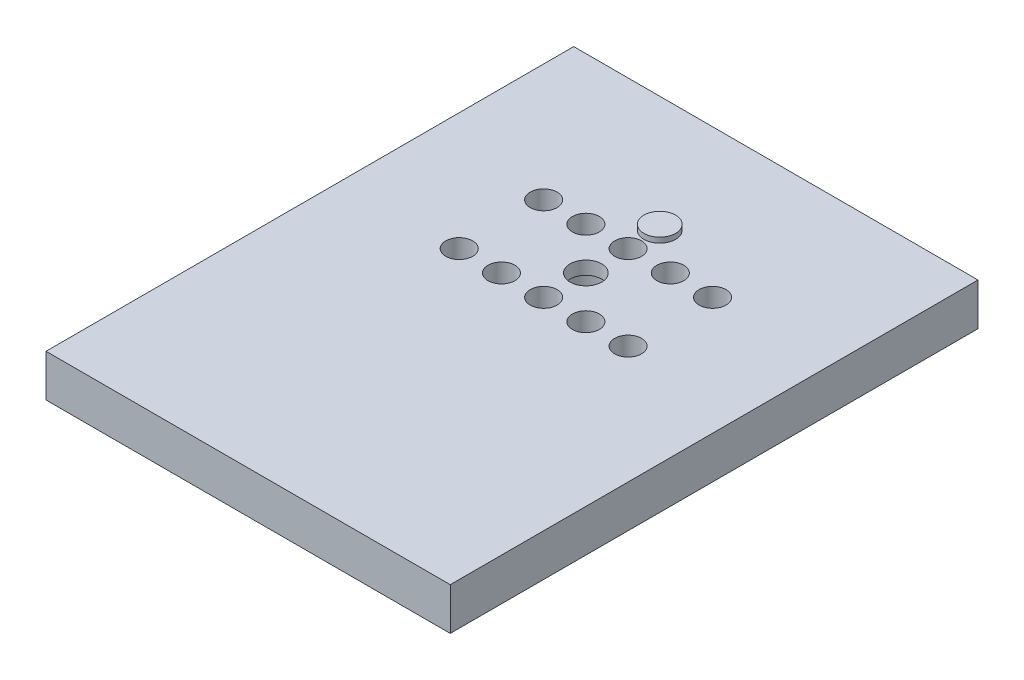
ISO-10303-21;
HEADER;
FILE_DESCRIPTION(('STEP AP214'),'2;1');
FILE_NAME('part.step','',(''),(''),'','','');
FILE_SCHEMA(('AUTOMOTIVE_DESIGN { 1 0 10303 214 1 1 1 1 }'));
ENDSEC;
DATA;
#1=APPLICATION_CONTEXT('core data for automotive mechanical design processes');
#2=APPLICATION_PROTOCOL_DEFINITION('international standard','automotive_design',2000,#1);
#3=PRODUCT_CONTEXT('',#1,'mechanical');
#4=PRODUCT('Part','Part','',(#3));
#5=PRODUCT_RELATED_PRODUCT_CATEGORY('part','',(#4));
#6=PRODUCT_DEFINITION_FORMATION('','',#4);
#7=PRODUCT_DEFINITION_CONTEXT('part definition',#1,'design');
#8=PRODUCT_DEFINITION('design','',#6,#7);
#9=PRODUCT_DEFINITION_SHAPE('','',#8);
#10=(LENGTH_UNIT() NAMED_UNIT(*) SI_UNIT(.MILLI.,.METRE.));
#11=(NAMED_UNIT(*) PLANE_ANGLE_UNIT() SI_UNIT($,.RADIAN.));
#12=(NAMED_UNIT(*) SI_UNIT($,.STERADIAN.) SOLID_ANGLE_UNIT());
#13=UNCERTAINTY_MEASURE_WITH_UNIT(LENGTH_MEASURE(1.E-05),#10,'distance_accuracy_value','');
#14=(GEOMETRIC_REPRESENTATION_CONTEXT(3) GLOBAL_UNCERTAINTY_ASSIGNED_CONTEXT((#13)) GLOBAL_UNIT_ASSIGNED_CONTEXT((#10,
#11,#12)) REPRESENTATION_CONTEXT('',''));
#15=CARTESIAN_POINT('',(0.,0.,0.));
#16=DIRECTION('',(0.,0.,1.));
#17=DIRECTION('',(1.,0.,0.));
#18=AXIS2_PLACEMENT_3D('',#15,#16,#17);
#19=CARTESIAN_POINT('',(0.,0.,-22.));
#20=DIRECTION('',(0.,1.,0.));
#21=DIRECTION('',(0.,0.,1.));
#22=AXIS2_PLACEMENT_3D('',#19,#20,#21);
#23=CYLINDRICAL_SURFACE('',#22,1.05);
#24=CARTESIAN_POINT('',(0.,0.,-22.));
#25=DIRECTION('',(0.,1.,0.));
#26=DIRECTION('',(0.,0.,1.));
#27=AXIS2_PLACEMENT_3D('',#24,#25,#26);
#28=CIRCLE('',#27,1.05);
#29=CARTESIAN_POINT('',(0.,0.,-20.95));
#30=VERTEX_POINT('',#29);
#31=EDGE_CURVE('E170',#30,#30,#28,.T.);
#32=ORIENTED_EDGE('',*,*,#31,.F.);
#33=EDGE_LOOP('',(#32));
#34=FACE_BOUND('',#33,.T.);
#35=CARTESIAN_POINT('',(0.,3.,-22.));
#36=DIRECTION('',(0.,1.,0.));
#37=DIRECTION('',(0.,0.,1.));
#38=AXIS2_PLACEMENT_3D('',#35,#36,#37);
#39=CIRCLE('',#38,1.05);
#40=CARTESIAN_POINT('',(0.,3.,-20.95));
#41=VERTEX_POINT('',#40);
#42=EDGE_CURVE('E37',#41,#41,#39,.F.);
#43=ORIENTED_EDGE('',*,*,#42,.F.);
#44=EDGE_LOOP('',(#43));
#45=FACE_BOUND('',#44,.T.);
#46=ADVANCED_FACE('F33',(#34,#45),#23,.F.);
#47=CARTESIAN_POINT('',(0.,0.,-6.00000000000003));
#48=DIRECTION('',(0.,1.,0.));
#49=DIRECTION('',(0.,0.,1.));
#50=AXIS2_PLACEMENT_3D('',#47,#48,#49);
#51=CYLINDRICAL_SURFACE('',#50,1.05);
#52=CARTESIAN_POINT('',(0.,0.,-6.00000000000003));
#53=DIRECTION('',(0.,1.,0.));
#54=DIRECTION('',(0.,0.,-1.));
#55=AXIS2_PLACEMENT_3D('',#52,#53,#54);
#56=CIRCLE('',#55,1.05);
#57=CARTESIAN_POINT('',(0.,0.,-7.05000000000003));
#58=VERTEX_POINT('',#57);
#59=EDGE_CURVE('E143',#58,#58,#56,.T.);
#60=ORIENTED_EDGE('',*,*,#59,.F.);
#61=EDGE_LOOP('',(#60));
#62=FACE_BOUND('',#61,.T.);
#63=CARTESIAN_POINT('',(0.,3.,-6.00000000000003));
#64=DIRECTION('',(0.,1.,0.));
#65=DIRECTION('',(0.,0.,1.));
#66=AXIS2_PLACEMENT_3D('',#63,#64,#65);
#67=CIRCLE('',#66,1.05);
#68=CARTESIAN_POINT('',(0.,3.,-4.95000000000003));
#69=VERTEX_POINT('',#68);
#70=EDGE_CURVE('E138',#69,#69,#67,.F.);
#71=ORIENTED_EDGE('',*,*,#70,.F.);
#72=EDGE_LOOP('',(#71));
#73=FACE_BOUND('',#72,.T.);
#74=ADVANCED_FACE('F214',(#62,#73),#51,.F.);
#75=CARTESIAN_POINT('',(8.,0.,-22.));
#76=DIRECTION('',(0.,1.,0.));
#77=DIRECTION('',(0.,0.,1.));
#78=AXIS2_PLACEMENT_3D('',#75,#76,#77);
#79=CYLINDRICAL_SURFACE('',#78,1.05);
#80=CARTESIAN_POINT('',(8.,0.,-22.));
#81=DIRECTION('',(0.,1.,0.));
#82=DIRECTION('',(0.,0.,1.));
#83=AXIS2_PLACEMENT_3D('',#80,#81,#82);
#84=CIRCLE('',#83,1.05);
#85=CARTESIAN_POINT('',(8.,0.,-20.95));
#86=VERTEX_POINT('',#85);
#87=EDGE_CURVE('E167',#86,#86,#84,.T.);
#88=ORIENTED_EDGE('',*,*,#87,.F.);
#89=EDGE_LOOP('',(#88));
#90=FACE_BOUND('',#89,.T.);
#91=CARTESIAN_POINT('',(8.,3.,-22.));
#92=DIRECTION('',(0.,1.,0.));
#93=DIRECTION('',(0.,0.,1.));
#94=AXIS2_PLACEMENT_3D('',#91,#92,#93);
#95=CIRCLE('',#94,1.05);
#96=CARTESIAN_POINT('',(8.,3.,-20.95));
#97=VERTEX_POINT('',#96);
#98=EDGE_CURVE('E136',#97,#97,#95,.F.);
#99=ORIENTED_EDGE('',*,*,#98,.F.);
#100=EDGE_LOOP('',(#99));
#101=FACE_BOUND('',#100,.T.);
#102=ADVANCED_FACE('F221',(#90,#101),#79,.F.);
#103=CARTESIAN_POINT('',(16.,0.,-22.));
#104=DIRECTION('',(0.,1.,0.));
#105=DIRECTION('',(0.,0.,1.));
#106=AXIS2_PLACEMENT_3D('',#103,#104,#105);
#107=CYLINDRICAL_SURFACE('',#106,1.05);
#108=CARTESIAN_POINT('',(16.,0.,-22.));
#109=DIRECTION('',(0.,1.,0.));
#110=DIRECTION('',(0.,0.,1.));
#111=AXIS2_PLACEMENT_3D('',#108,#109,#110);
#112=CIRCLE('',#111,1.05);
#113=CARTESIAN_POINT('',(16.,0.,-20.95));
#114=VERTEX_POINT('',#113);
#115=EDGE_CURVE('E171',#114,#114,#112,.T.);
#116=ORIENTED_EDGE('',*,*,#115,.F.);
#117=EDGE_LOOP('',(#116));
#118=FACE_BOUND('',#117,.T.);
#119=CARTESIAN_POINT('',(16.,3.,-22.));
#120=DIRECTION('',(0.,1.,0.));
#121=DIRECTION('',(0.,0.,1.));
#122=AXIS2_PLACEMENT_3D('',#119,#120,#121);
#123=CIRCLE('',#122,1.05);
#124=CARTESIAN_POINT('',(16.,3.,-20.95));
#125=VERTEX_POINT('',#124);
#126=EDGE_CURVE('E133',#125,#125,#123,.F.);
#127=ORIENTED_EDGE('',*,*,#126,.F.);
#128=EDGE_LOOP('',(#127));
#129=FACE_BOUND('',#128,.T.);
#130=ADVANCED_FACE('F324',(#118,#129),#107,.F.);
#131=CARTESIAN_POINT('',(-16.,0.,-6.00000000000013));
#132=DIRECTION('',(0.,1.,0.));
#133=DIRECTION('',(0.,0.,1.));
#134=AXIS2_PLACEMENT_3D('',#131,#132,#133);
#135=CYLINDRICAL_SURFACE('',#134,1.05);
#136=CARTESIAN_POINT('',(-16.,0.,-6.00000000000013));
#137=DIRECTION('',(0.,1.,0.));
#138=DIRECTION('',(0.,0.,-1.));
#139=AXIS2_PLACEMENT_3D('',#136,#137,#138);
#140=CIRCLE('',#139,1.05);
#141=CARTESIAN_POINT('',(-16.,0.,-7.05000000000013));
#142=VERTEX_POINT('',#141);
#143=EDGE_CURVE('E174',#142,#142,#140,.T.);
#144=ORIENTED_EDGE('',*,*,#143,.F.);
#145=EDGE_LOOP('',(#144));
#146=FACE_BOUND('',#145,.T.);
#147=CARTESIAN_POINT('',(-16.,3.,-6.00000000000013));
#148=DIRECTION('',(0.,1.,0.));
#149=DIRECTION('',(0.,0.,1.));
#150=AXIS2_PLACEMENT_3D('',#147,#148,#149);
#151=CIRCLE('',#150,1.05);
#152=CARTESIAN_POINT('',(-16.,3.,-4.95000000000013));
#153=VERTEX_POINT('',#152);
#154=EDGE_CURVE('E130',#153,#153,#151,.F.);
#155=ORIENTED_EDGE('',*,*,#154,.F.);
#156=EDGE_LOOP('',(#155));
#157=FACE_BOUND('',#156,.T.);
#158=ADVANCED_FACE('F334',(#146,#157),#135,.F.);
#159=CARTESIAN_POINT('',(-8.,0.,-22.));
#160=DIRECTION('',(0.,1.,0.));
#161=DIRECTION('',(0.,0.,1.));
#162=AXIS2_PLACEMENT_3D('',#159,#160,#161);
#163=CYLINDRICAL_SURFACE('',#162,1.05);
#164=CARTESIAN_POINT('',(-8.,0.,-22.));
#165=DIRECTION('',(0.,1.,0.));
#166=DIRECTION('',(0.,0.,1.));
#167=AXIS2_PLACEMENT_3D('',#164,#165,#166);
#168=CIRCLE('',#167,1.05);
#169=CARTESIAN_POINT('',(-8.,0.,-20.95));
#170=VERTEX_POINT('',#169);
#171=EDGE_CURVE('E161',#170,#170,#168,.T.);
#172=ORIENTED_EDGE('',*,*,#171,.F.);
#173=EDGE_LOOP('',(#172));
#174=FACE_BOUND('',#173,.T.);
#175=CARTESIAN_POINT('',(-8.,3.,-22.));
#176=DIRECTION('',(0.,1.,0.));
#177=DIRECTION('',(0.,0.,1.));
#178=AXIS2_PLACEMENT_3D('',#175,#176,#177);
#179=CIRCLE('',#178,1.05);
#180=CARTESIAN_POINT('',(-8.,3.,-20.95));
#181=VERTEX_POINT('',#180);
#182=EDGE_CURVE('E127',#181,#181,#179,.F.);
#183=ORIENTED_EDGE('',*,*,#182,.F.);
#184=EDGE_LOOP('',(#183));
#185=FACE_BOUND('',#184,.T.);
#186=ADVANCED_FACE('F228',(#174,#185),#163,.F.);
#187=CARTESIAN_POINT('',(-16.,0.,-21.9999999999999));
#188=DIRECTION('',(0.,1.,0.));
#189=DIRECTION('',(0.,0.,1.));
#190=AXIS2_PLACEMENT_3D('',#187,#188,#189);
#191=CYLINDRICAL_SURFACE('',#190,1.05);
#192=CARTESIAN_POINT('',(-16.,0.,-21.9999999999999));
#193=DIRECTION('',(0.,1.,0.));
#194=DIRECTION('',(0.,0.,1.));
#195=AXIS2_PLACEMENT_3D('',#192,#193,#194);
#196=CIRCLE('',#195,1.05);
#197=CARTESIAN_POINT('',(-16.,0.,-20.9499999999999));
#198=VERTEX_POINT('',#197);
#199=EDGE_CURVE('E158',#198,#198,#196,.T.);
#200=ORIENTED_EDGE('',*,*,#199,.F.);
#201=EDGE_LOOP('',(#200));
#202=FACE_BOUND('',#201,.T.);
#203=CARTESIAN_POINT('',(-16.,3.,-21.9999999999999));
#204=DIRECTION('',(0.,1.,0.));
#205=DIRECTION('',(0.,0.,1.));
#206=AXIS2_PLACEMENT_3D('',#203,#204,#205);
#207=CIRCLE('',#206,1.05);
#208=CARTESIAN_POINT('',(-16.,3.,-20.9499999999999));
#209=VERTEX_POINT('',#208);
#210=EDGE_CURVE('E124',#209,#209,#207,.F.);
#211=ORIENTED_EDGE('',*,*,#210,.F.);
#212=EDGE_LOOP('',(#211));
#213=FACE_BOUND('',#212,.T.);
#214=ADVANCED_FACE('F352',(#202,#213),#191,.F.);
#215=CARTESIAN_POINT('',(-8.,0.,-6.00000000000008));
#216=DIRECTION('',(0.,1.,0.));
#217=DIRECTION('',(0.,0.,1.));
#218=AXIS2_PLACEMENT_3D('',#215,#216,#217);
#219=CYLINDRICAL_SURFACE('',#218,1.05);
#220=CARTESIAN_POINT('',(-8.,0.,-6.00000000000008));
#221=DIRECTION('',(0.,1.,0.));
#222=DIRECTION('',(0.,0.,-1.));
#223=AXIS2_PLACEMENT_3D('',#220,#221,#222);
#224=CIRCLE('',#223,1.05);
#225=CARTESIAN_POINT('',(-8.,0.,-7.05000000000008));
#226=VERTEX_POINT('',#225);
#227=EDGE_CURVE('E162',#226,#226,#224,.T.);
#228=ORIENTED_EDGE('',*,*,#227,.F.);
#229=EDGE_LOOP('',(#228));
#230=FACE_BOUND('',#229,.T.);
#231=CARTESIAN_POINT('',(-8.,3.,-6.00000000000008));
#232=DIRECTION('',(0.,1.,0.));
#233=DIRECTION('',(0.,0.,1.));
#234=AXIS2_PLACEMENT_3D('',#231,#232,#233);
#235=CIRCLE('',#234,1.05);
#236=CARTESIAN_POINT('',(-8.,3.,-4.95000000000008));
#237=VERTEX_POINT('',#236);
#238=EDGE_CURVE('E121',#237,#237,#235,.F.);
#239=ORIENTED_EDGE('',*,*,#238,.F.);
#240=EDGE_LOOP('',(#239));
#241=FACE_BOUND('',#240,.T.);
#242=ADVANCED_FACE('F361',(#230,#241),#219,.F.);
#243=CARTESIAN_POINT('',(16.,0.,-6.00000000000003));
#244=DIRECTION('',(0.,1.,0.));
#245=DIRECTION('',(0.,0.,1.));
#246=AXIS2_PLACEMENT_3D('',#243,#244,#245);
#247=CYLINDRICAL_SURFACE('',#246,1.05);
#248=CARTESIAN_POINT('',(16.,0.,-6.00000000000003));
#249=DIRECTION('',(0.,1.,0.));
#250=DIRECTION('',(0.,0.,-1.));
#251=AXIS2_PLACEMENT_3D('',#248,#249,#250);
#252=CIRCLE('',#251,1.05);
#253=CARTESIAN_POINT('',(16.,0.,-7.05000000000003));
#254=VERTEX_POINT('',#253);
#255=EDGE_CURVE('E152',#254,#254,#252,.T.);
#256=ORIENTED_EDGE('',*,*,#255,.F.);
#257=EDGE_LOOP('',(#256));
#258=FACE_BOUND('',#257,.T.);
#259=CARTESIAN_POINT('',(16.,3.,-6.00000000000003));
#260=DIRECTION('',(0.,1.,0.));
#261=DIRECTION('',(0.,0.,1.));
#262=AXIS2_PLACEMENT_3D('',#259,#260,#261);
#263=CIRCLE('',#262,1.05);
#264=CARTESIAN_POINT('',(16.,3.,-4.95000000000003));
#265=VERTEX_POINT('',#264);
#266=EDGE_CURVE('E117',#265,#265,#263,.F.);
#267=ORIENTED_EDGE('',*,*,#266,.F.);
#268=EDGE_LOOP('',(#267));
#269=FACE_BOUND('',#268,.T.);
#270=ADVANCED_FACE('F371',(#258,#269),#247,.F.);
#271=CARTESIAN_POINT('',(8.,0.,-6.00000000000003));
#272=DIRECTION('',(0.,1.,0.));
#273=DIRECTION('',(0.,0.,1.));
#274=AXIS2_PLACEMENT_3D('',#271,#272,#273);
#275=CYLINDRICAL_SURFACE('',#274,1.05);
#276=CARTESIAN_POINT('',(8.,0.,-6.00000000000003));
#277=DIRECTION('',(0.,1.,0.));
#278=DIRECTION('',(0.,0.,-1.));
#279=AXIS2_PLACEMENT_3D('',#276,#277,#278);
#280=CIRCLE('',#279,1.05);
#281=CARTESIAN_POINT('',(8.,0.,-7.05000000000003));
#282=VERTEX_POINT('',#281);
#283=EDGE_CURVE('E147',#282,#282,#280,.T.);
#284=ORIENTED_EDGE('',*,*,#283,.F.);
#285=EDGE_LOOP('',(#284));
#286=FACE_BOUND('',#285,.T.);
#287=CARTESIAN_POINT('',(8.,3.,-6.00000000000003));
#288=DIRECTION('',(0.,1.,0.));
#289=DIRECTION('',(0.,0.,1.));
#290=AXIS2_PLACEMENT_3D('',#287,#288,#289);
#291=CIRCLE('',#290,1.05);
#292=CARTESIAN_POINT('',(8.,3.,-4.95000000000003));
#293=VERTEX_POINT('',#292);
#294=EDGE_CURVE('E114',#293,#293,#291,.F.);
#295=ORIENTED_EDGE('',*,*,#294,.F.);
#296=EDGE_LOOP('',(#295));
#297=FACE_BOUND('',#296,.T.);
#298=ADVANCED_FACE('F209',(#286,#297),#275,.F.);
#299=CARTESIAN_POINT('',(0.,8.,-14.));
#300=DIRECTION('',(0.,-1.,0.));
#301=DIRECTION('',(0.,0.,-1.));
#302=AXIS2_PLACEMENT_3D('',#299,#300,#301);
#303=CYLINDRICAL_SURFACE('',#302,3.);
#304=CARTESIAN_POINT('',(0.,8.,-14.));
#305=DIRECTION('',(0.,1.,0.));
#306=DIRECTION('',(0.,0.,1.));
#307=AXIS2_PLACEMENT_3D('',#304,#305,#306);
#308=CIRCLE('',#307,3.);
#309=CARTESIAN_POINT('',(0.,8.,-11.));
#310=VERTEX_POINT('',#309);
#311=EDGE_CURVE('E104',#310,#310,#308,.T.);
#312=ORIENTED_EDGE('',*,*,#311,.T.);
#313=EDGE_LOOP('',(#312));
#314=FACE_BOUND('',#313,.T.);
#315=CARTESIAN_POINT('',(0.,5.5,-14.));
#316=DIRECTION('',(0.,-1.,0.));
#317=DIRECTION('',(0.,0.,-1.));
#318=AXIS2_PLACEMENT_3D('',#315,#316,#317);
#319=CIRCLE('',#318,3.);
#320=CARTESIAN_POINT('',(0.,5.5,-17.));
#321=VERTEX_POINT('',#320);
#322=EDGE_CURVE('E110',#321,#321,#319,.T.);
#323=ORIENTED_EDGE('',*,*,#322,.T.);
#324=EDGE_LOOP('',(#323));
#325=FACE_BOUND('',#324,.T.);
#326=ADVANCED_FACE('F195',(#314,#325),#303,.F.);
#327=CARTESIAN_POINT('',(0.,8.,0.));
#328=DIRECTION('',(0.,1.,0.));
#329=DIRECTION('',(0.,0.,1.));
#330=AXIS2_PLACEMENT_3D('',#327,#328,#329);
#331=PLANE('',#330);
#332=CARTESIAN_POINT('',(1.66533453693773E-13,8.,-5.9999999999999));
#333=DIRECTION('',(0.,1.,0.));
#334=DIRECTION('',(0.,0.,1.));
#335=AXIS2_PLACEMENT_3D('',#332,#333,#334);
#336=CIRCLE('',#335,2.55);
#337=CARTESIAN_POINT('',(1.66533453693773E-13,8.,-3.4499999999999));
#338=VERTEX_POINT('',#337);
#339=EDGE_CURVE('E639',#338,#338,#336,.T.);
#340=ORIENTED_EDGE('',*,*,#339,.F.);
#341=EDGE_LOOP('',(#340));
#342=FACE_BOUND('',#341,.T.);
#343=CARTESIAN_POINT('',(8.00000000000017,8.,-5.9999999999999));
#344=DIRECTION('',(0.,1.,0.));
#345=DIRECTION('',(0.,0.,1.));
#346=AXIS2_PLACEMENT_3D('',#343,#344,#345);
#347=CIRCLE('',#346,2.55);
#348=CARTESIAN_POINT('',(8.00000000000017,8.,-3.4499999999999));
#349=VERTEX_POINT('',#348);
#350=EDGE_CURVE('E629',#349,#349,#347,.T.);
#351=ORIENTED_EDGE('',*,*,#350,.F.);
#352=EDGE_LOOP('',(#351));
#353=FACE_BOUND('',#352,.T.);
#354=CARTESIAN_POINT('',(16.0000000000002,8.,-5.9999999999999));
#355=DIRECTION('',(0.,1.,0.));
#356=DIRECTION('',(0.,0.,1.));
#357=AXIS2_PLACEMENT_3D('',#354,#355,#356);
#358=CIRCLE('',#357,2.55);
#359=CARTESIAN_POINT('',(16.0000000000002,8.,-3.4499999999999));
#360=VERTEX_POINT('',#359);
#361=EDGE_CURVE('E655',#360,#360,#358,.T.);
#362=ORIENTED_EDGE('',*,*,#361,.F.);
#363=EDGE_LOOP('',(#362));
#364=FACE_BOUND('',#363,.T.);
#365=CARTESIAN_POINT('',(-15.9999999999998,8.,-5.9999999999999));
#366=DIRECTION('',(0.,1.,0.));
#367=DIRECTION('',(0.,0.,1.));
#368=AXIS2_PLACEMENT_3D('',#365,#366,#367);
#369=CIRCLE('',#368,2.55);
#370=CARTESIAN_POINT('',(-15.9999999999998,8.,-3.4499999999999));
#371=VERTEX_POINT('',#370);
#372=EDGE_CURVE('E646',#371,#371,#369,.T.);
#373=ORIENTED_EDGE('',*,*,#372,.F.);
#374=EDGE_LOOP('',(#373));
#375=FACE_BOUND('',#374,.T.);
#376=CARTESIAN_POINT('',(0.,8.,-21.9999999999999));
#377=DIRECTION('',(0.,1.,0.));
#378=DIRECTION('',(0.,0.,1.));
#379=AXIS2_PLACEMENT_3D('',#376,#377,#378);
#380=CIRCLE('',#379,2.55);
#381=CARTESIAN_POINT('',(0.,8.,-19.4499999999999));
#382=VERTEX_POINT('',#381);
#383=EDGE_CURVE('E595',#382,#382,#380,.T.);
#384=ORIENTED_EDGE('',*,*,#383,.F.);
#385=EDGE_LOOP('',(#384));
#386=FACE_BOUND('',#385,.T.);
#387=CARTESIAN_POINT('',(8.,8.,-21.9999999999999));
#388=DIRECTION('',(0.,1.,0.));
#389=DIRECTION('',(0.,0.,1.));
#390=AXIS2_PLACEMENT_3D('',#387,#388,#389);
#391=CIRCLE('',#390,2.55);
#392=CARTESIAN_POINT('',(8.,8.,-19.4499999999999));
#393=VERTEX_POINT('',#392);
#394=EDGE_CURVE('E601',#393,#393,#391,.T.);
#395=ORIENTED_EDGE('',*,*,#394,.F.);
#396=EDGE_LOOP('',(#395));
#397=FACE_BOUND('',#396,.T.);
#398=CARTESIAN_POINT('',(16.,8.,-21.9999999999999));
#399=DIRECTION('',(0.,1.,0.));
#400=DIRECTION('',(0.,0.,1.));
#401=AXIS2_PLACEMENT_3D('',#398,#399,#400);
#402=CIRCLE('',#401,2.55);
#403=CARTESIAN_POINT('',(16.,8.,-19.4499999999999));
#404=VERTEX_POINT('',#403);
#405=EDGE_CURVE('E622',#404,#404,#402,.T.);
#406=ORIENTED_EDGE('',*,*,#405,.F.);
#407=EDGE_LOOP('',(#406));
#408=FACE_BOUND('',#407,.T.);
#409=CARTESIAN_POINT('',(-7.99999999999983,8.,-5.9999999999999));
#410=DIRECTION('',(0.,1.,0.));
#411=DIRECTION('',(0.,0.,1.));
#412=AXIS2_PLACEMENT_3D('',#409,#410,#411);
#413=CIRCLE('',#412,2.55);
#414=CARTESIAN_POINT('',(-7.99999999999983,8.,-3.4499999999999));
#415=VERTEX_POINT('',#414);
#416=EDGE_CURVE('E633',#415,#415,#413,.T.);
#417=ORIENTED_EDGE('',*,*,#416,.F.);
#418=EDGE_LOOP('',(#417));
#419=FACE_BOUND('',#418,.T.);
#420=CARTESIAN_POINT('',(-16.,8.,-21.9999999999999));
#421=DIRECTION('',(0.,1.,0.));
#422=DIRECTION('',(0.,0.,1.));
#423=AXIS2_PLACEMENT_3D('',#420,#421,#422);
#424=CIRCLE('',#423,2.55);
#425=CARTESIAN_POINT('',(-16.,8.,-19.4499999999999));
#426=VERTEX_POINT('',#425);
#427=EDGE_CURVE('E662',#426,#426,#424,.T.);
#428=ORIENTED_EDGE('',*,*,#427,.F.);
#429=EDGE_LOOP('',(#428));
#430=FACE_BOUND('',#429,.T.);
#431=CARTESIAN_POINT('',(-8.,8.,-21.9999999999999));
#432=DIRECTION('',(0.,1.,0.));
#433=DIRECTION('',(0.,0.,1.));
#434=AXIS2_PLACEMENT_3D('',#431,#432,#433);
#435=CIRCLE('',#434,2.55);
#436=CARTESIAN_POINT('',(-8.,8.,-19.4499999999999));
#437=VERTEX_POINT('',#436);
#438=EDGE_CURVE('E156',#437,#437,#435,.T.);
#439=ORIENTED_EDGE('',*,*,#438,.F.);
#440=EDGE_LOOP('',(#439));
#441=FACE_BOUND('',#440,.T.);
#442=CARTESIAN_POINT('',(0.,8.,-28.));
#443=DIRECTION('',(0.,1.,0.));
#444=DIRECTION('',(0.,0.,1.));
#445=AXIS2_PLACEMENT_3D('',#442,#443,#444);
#446=CIRCLE('',#445,3.);
#447=CARTESIAN_POINT('',(0.,8.,-25.));
#448=VERTEX_POINT('',#447);
#449=EDGE_CURVE('E181',#448,#448,#446,.T.);
#450=ORIENTED_EDGE('',*,*,#449,.F.);
#451=EDGE_LOOP('',(#450));
#452=FACE_BOUND('',#451,.T.);
#453=DIRECTION('',(0.,0.,-1.));
#454=VECTOR('',#453,1.);
#455=CARTESIAN_POINT('',(38.3,8.,-50.));
#456=LINE('',#455,#454);
#457=CARTESIAN_POINT('',(38.3,8.,50.));
#458=VERTEX_POINT('',#457);
#459=CARTESIAN_POINT('',(38.3,8.,-50.));
#460=VERTEX_POINT('',#459);
#461=EDGE_CURVE('E88',#458,#460,#456,.T.);
#462=ORIENTED_EDGE('',*,*,#461,.T.);
#463=DIRECTION('',(-1.,0.,0.));
#464=VECTOR('',#463,1.);
#465=CARTESIAN_POINT('',(-38.3,8.,-50.));
#466=LINE('',#465,#464);
#467=CARTESIAN_POINT('',(-38.3,8.,-50.));
#468=VERTEX_POINT('',#467);
#469=EDGE_CURVE('E82',#460,#468,#466,.T.);
#470=ORIENTED_EDGE('',*,*,#469,.T.);
#471=DIRECTION('',(0.,0.,1.));
#472=VECTOR('',#471,1.);
#473=CARTESIAN_POINT('',(-38.3,8.,-50.));
#474=LINE('',#473,#472);
#475=CARTESIAN_POINT('',(-38.3,8.,50.));
#476=VERTEX_POINT('',#475);
#477=EDGE_CURVE('E86',#468,#476,#474,.T.);
#478=ORIENTED_EDGE('',*,*,#477,.T.);
#479=DIRECTION('',(1.,0.,0.));
#480=VECTOR('',#479,1.);
#481=CARTESIAN_POINT('',(-38.3,8.,50.));
#482=LINE('',#481,#480);
#483=EDGE_CURVE('E52',#476,#458,#482,.T.);
#484=ORIENTED_EDGE('',*,*,#483,.T.);
#485=EDGE_LOOP('',(#462,#470,#478,#484));
#486=FACE_BOUND('',#485,.T.);
#487=ORIENTED_EDGE('',*,*,#311,.F.);
#488=EDGE_LOOP('',(#487));
#489=FACE_BOUND('',#488,.T.);
#490=ADVANCED_FACE('F83',(#342,#353,#364,#375,#386,#397,#408,#419,#430,#441,#452,#486,#489),
#331,.T.);
#491=CARTESIAN_POINT('',(0.,0.,0.));
#492=DIRECTION('',(0.,1.,0.));
#493=DIRECTION('',(0.,0.,1.));
#494=AXIS2_PLACEMENT_3D('',#491,#492,#493);
#495=PLANE('',#494);
#496=ORIENTED_EDGE('',*,*,#283,.T.);
#497=EDGE_LOOP('',(#496));
#498=FACE_BOUND('',#497,.T.);
#499=ORIENTED_EDGE('',*,*,#255,.T.);
#500=EDGE_LOOP('',(#499));
#501=FACE_BOUND('',#500,.T.);
#502=ORIENTED_EDGE('',*,*,#227,.T.);
#503=EDGE_LOOP('',(#502));
#504=FACE_BOUND('',#503,.T.);
#505=ORIENTED_EDGE('',*,*,#199,.T.);
#506=EDGE_LOOP('',(#505));
#507=FACE_BOUND('',#506,.T.);
#508=ORIENTED_EDGE('',*,*,#171,.T.);
#509=EDGE_LOOP('',(#508));
#510=FACE_BOUND('',#509,.T.);
#511=ORIENTED_EDGE('',*,*,#143,.T.);
#512=EDGE_LOOP('',(#511));
#513=FACE_BOUND('',#512,.T.);
#514=ORIENTED_EDGE('',*,*,#115,.T.);
#515=EDGE_LOOP('',(#514));
#516=FACE_BOUND('',#515,.T.);
#517=ORIENTED_EDGE('',*,*,#87,.T.);
#518=EDGE_LOOP('',(#517));
#519=FACE_BOUND('',#518,.T.);
#520=ORIENTED_EDGE('',*,*,#59,.T.);
#521=EDGE_LOOP('',(#520));
#522=FACE_BOUND('',#521,.T.);
#523=ORIENTED_EDGE('',*,*,#31,.T.);
#524=EDGE_LOOP('',(#523));
#525=FACE_BOUND('',#524,.T.);
#526=CARTESIAN_POINT('',(0.,0.,-14.));
#527=DIRECTION('',(0.,-1.,0.));
#528=DIRECTION('',(0.,0.,-1.));
#529=AXIS2_PLACEMENT_3D('',#526,#527,#528);
#530=CIRCLE('',#529,4.5);
#531=CARTESIAN_POINT('',(0.,0.,-18.5));
#532=VERTEX_POINT('',#531);
#533=EDGE_CURVE('E185',#532,#532,#530,.T.);
#534=ORIENTED_EDGE('',*,*,#533,.F.);
#535=EDGE_LOOP('',(#534));
#536=FACE_BOUND('',#535,.T.);
#537=DIRECTION('',(0.,0.,-1.));
#538=VECTOR('',#537,1.);
#539=CARTESIAN_POINT('',(38.3,0.,-50.));
#540=LINE('',#539,#538);
#541=CARTESIAN_POINT('',(38.3,0.,50.));
#542=VERTEX_POINT('',#541);
#543=CARTESIAN_POINT('',(38.3,0.,-50.));
#544=VERTEX_POINT('',#543);
#545=EDGE_CURVE('E101',#542,#544,#540,.T.);
#546=ORIENTED_EDGE('',*,*,#545,.F.);
#547=DIRECTION('',(1.,0.,0.));
#548=VECTOR('',#547,1.);
#549=CARTESIAN_POINT('',(-38.3,0.,50.));
#550=LINE('',#549,#548);
#551=CARTESIAN_POINT('',(-38.3,0.,50.));
#552=VERTEX_POINT('',#551);
#553=EDGE_CURVE('E75',#552,#542,#550,.T.);
#554=ORIENTED_EDGE('',*,*,#553,.F.);
#555=DIRECTION('',(0.,0.,1.));
#556=VECTOR('',#555,1.);
#557=CARTESIAN_POINT('',(-38.3,0.,-50.));
#558=LINE('',#557,#556);
#559=CARTESIAN_POINT('',(-38.3,0.,-50.));
#560=VERTEX_POINT('',#559);
#561=EDGE_CURVE('E69',#560,#552,#558,.T.);
#562=ORIENTED_EDGE('',*,*,#561,.F.);
#563=DIRECTION('',(-1.,0.,0.));
#564=VECTOR('',#563,1.);
#565=CARTESIAN_POINT('',(-38.3,0.,-50.));
#566=LINE('',#565,#564);
#567=EDGE_CURVE('E92',#544,#560,#566,.T.);
#568=ORIENTED_EDGE('',*,*,#567,.F.);
#569=EDGE_LOOP('',(#546,#554,#562,#568));
#570=FACE_BOUND('',#569,.T.);
#571=ADVANCED_FACE('F198',(#498,#501,#504,#507,#510,#513,#516,#519,#522,#525,#536,#570),#495,.F.);
#572=CARTESIAN_POINT('',(38.3,8.,-50.));
#573=DIRECTION('',(-1.,0.,0.));
#574=DIRECTION('',(0.,0.,1.));
#575=AXIS2_PLACEMENT_3D('',#572,#573,#574);
#576=PLANE('',#575);
#577=ORIENTED_EDGE('',*,*,#545,.T.);
#578=DIRECTION('',(0.,-1.,0.));
#579=VECTOR('',#578,1.);
#580=CARTESIAN_POINT('',(38.3,8.,-50.));
#581=LINE('',#580,#579);
#582=EDGE_CURVE('E11',#460,#544,#581,.T.);
#583=ORIENTED_EDGE('',*,*,#582,.F.);
#584=ORIENTED_EDGE('',*,*,#461,.F.);
#585=DIRECTION('',(0.,-1.,0.));
#586=VECTOR('',#585,1.);
#587=CARTESIAN_POINT('',(38.3,8.,50.));
#588=LINE('',#587,#586);
#589=EDGE_CURVE('E97',#458,#542,#588,.T.);
#590=ORIENTED_EDGE('',*,*,#589,.T.);
#591=EDGE_LOOP('',(#577,#583,#584,#590));
#592=FACE_BOUND('',#591,.T.);
#593=ADVANCED_FACE('F35',(#592),#576,.F.);
#594=CARTESIAN_POINT('',(-38.3,8.,-50.));
#595=DIRECTION('',(0.,0.,1.));
#596=DIRECTION('',(1.,0.,0.));
#597=AXIS2_PLACEMENT_3D('',#594,#595,#596);
#598=PLANE('',#597);
#599=ORIENTED_EDGE('',*,*,#567,.T.);
#600=DIRECTION('',(0.,-1.,0.));
#601=VECTOR('',#600,1.);
#602=CARTESIAN_POINT('',(-38.3,8.,-50.));
#603=LINE('',#602,#601);
#604=EDGE_CURVE('E43',#468,#560,#603,.T.);
#605=ORIENTED_EDGE('',*,*,#604,.F.);
#606=ORIENTED_EDGE('',*,*,#469,.F.);
#607=ORIENTED_EDGE('',*,*,#582,.T.);
#608=EDGE_LOOP('',(#599,#605,#606,#607));
#609=FACE_BOUND('',#608,.T.);
#610=ADVANCED_FACE('F91',(#609),#598,.F.);
#611=CARTESIAN_POINT('',(-38.3,8.,-50.));
#612=DIRECTION('',(1.,0.,0.));
#613=DIRECTION('',(0.,0.,-1.));
#614=AXIS2_PLACEMENT_3D('',#611,#612,#613);
#615=PLANE('',#614);
#616=ORIENTED_EDGE('',*,*,#561,.T.);
#617=DIRECTION('',(0.,-1.,0.));
#618=VECTOR('',#617,1.);
#619=CARTESIAN_POINT('',(-38.3,8.,50.));
#620=LINE('',#619,#618);
#621=EDGE_CURVE('E93',#476,#552,#620,.T.);
#622=ORIENTED_EDGE('',*,*,#621,.F.);
#623=ORIENTED_EDGE('',*,*,#477,.F.);
#624=ORIENTED_EDGE('',*,*,#604,.T.);
#625=EDGE_LOOP('',(#616,#622,#623,#624));
#626=FACE_BOUND('',#625,.T.);
#627=ADVANCED_FACE('F95',(#626),#615,.F.);
#628=CARTESIAN_POINT('',(-38.3,8.,50.));
#629=DIRECTION('',(0.,0.,-1.));
#630=DIRECTION('',(-1.,0.,0.));
#631=AXIS2_PLACEMENT_3D('',#628,#629,#630);
#632=PLANE('',#631);
#633=ORIENTED_EDGE('',*,*,#553,.T.);
#634=ORIENTED_EDGE('',*,*,#589,.F.);
#635=ORIENTED_EDGE('',*,*,#483,.F.);
#636=ORIENTED_EDGE('',*,*,#621,.T.);
#637=EDGE_LOOP('',(#633,#634,#635,#636));
#638=FACE_BOUND('',#637,.T.);
#639=ADVANCED_FACE('F244',(#638),#632,.F.);
#640=CARTESIAN_POINT('',(0.,5.5,-14.));
#641=DIRECTION('',(0.,-1.,0.));
#642=DIRECTION('',(0.,0.,-1.));
#643=AXIS2_PLACEMENT_3D('',#640,#641,#642);
#644=CYLINDRICAL_SURFACE('',#643,4.5);
#645=CARTESIAN_POINT('',(0.,5.5,-14.));
#646=DIRECTION('',(0.,-1.,0.));
#647=DIRECTION('',(0.,0.,-1.));
#648=AXIS2_PLACEMENT_3D('',#645,#646,#647);
#649=CIRCLE('',#648,4.5);
#650=CARTESIAN_POINT('',(0.,5.5,-18.5));
#651=VERTEX_POINT('',#650);
#652=EDGE_CURVE('E113',#651,#651,#649,.T.);
#653=ORIENTED_EDGE('',*,*,#652,.F.);
#654=EDGE_LOOP('',(#653));
#655=FACE_BOUND('',#654,.T.);
#656=ORIENTED_EDGE('',*,*,#533,.T.);
#657=EDGE_LOOP('',(#656));
#658=FACE_BOUND('',#657,.T.);
#659=ADVANCED_FACE('F241',(#655,#658),#644,.F.);
#660=CARTESIAN_POINT('',(0.,5.5,-14.));
#661=DIRECTION('',(0.,-1.,0.));
#662=DIRECTION('',(0.,0.,-1.));
#663=AXIS2_PLACEMENT_3D('',#660,#661,#662);
#664=PLANE('',#663);
#665=ORIENTED_EDGE('',*,*,#322,.F.);
#666=EDGE_LOOP('',(#665));
#667=FACE_BOUND('',#666,.T.);
#668=ORIENTED_EDGE('',*,*,#652,.T.);
#669=EDGE_LOOP('',(#668));
#670=FACE_BOUND('',#669,.T.);
#671=ADVANCED_FACE('F237',(#667,#670),#664,.T.);
#672=CARTESIAN_POINT('',(0.,9.,-28.));
#673=DIRECTION('',(0.,-1.,0.));
#674=DIRECTION('',(0.,0.,-1.));
#675=AXIS2_PLACEMENT_3D('',#672,#673,#674);
#676=CYLINDRICAL_SURFACE('',#675,3.);
#677=CARTESIAN_POINT('',(0.,9.,-28.));
#678=DIRECTION('',(0.,1.,0.));
#679=DIRECTION('',(0.,0.,1.));
#680=AXIS2_PLACEMENT_3D('',#677,#678,#679);
#681=CIRCLE('',#680,3.);
#682=CARTESIAN_POINT('',(0.,9.,-25.));
#683=VERTEX_POINT('',#682);
#684=EDGE_CURVE('E182',#683,#683,#681,.T.);
#685=ORIENTED_EDGE('',*,*,#684,.F.);
#686=EDGE_LOOP('',(#685));
#687=FACE_BOUND('',#686,.T.);
#688=ORIENTED_EDGE('',*,*,#449,.T.);
#689=EDGE_LOOP('',(#688));
#690=FACE_BOUND('',#689,.T.);
#691=ADVANCED_FACE('F233',(#687,#690),#676,.T.);
#692=CARTESIAN_POINT('',(0.,9.,-28.));
#693=DIRECTION('',(0.,1.,0.));
#694=DIRECTION('',(0.,0.,1.));
#695=AXIS2_PLACEMENT_3D('',#692,#693,#694);
#696=PLANE('',#695);
#697=ORIENTED_EDGE('',*,*,#684,.T.);
#698=EDGE_LOOP('',(#697));
#699=FACE_BOUND('',#698,.T.);
#700=ADVANCED_FACE('F230',(#699),#696,.T.);
#701=CARTESIAN_POINT('',(8.00000000000017,3.,-5.9999999999999));
#702=DIRECTION('',(0.,1.,0.));
#703=DIRECTION('',(0.,0.,1.));
#704=AXIS2_PLACEMENT_3D('',#701,#702,#703);
#705=PLANE('',#704);
#706=CARTESIAN_POINT('',(8.00000000000017,3.,-5.9999999999999));
#707=DIRECTION('',(0.,1.,0.));
#708=DIRECTION('',(0.,0.,1.));
#709=AXIS2_PLACEMENT_3D('',#706,#707,#708);
#710=CIRCLE('',#709,2.55);
#711=CARTESIAN_POINT('',(8.00000000000017,3.,-3.4499999999999));
#712=VERTEX_POINT('',#711);
#713=EDGE_CURVE('E643',#712,#712,#710,.T.);
#714=ORIENTED_EDGE('',*,*,#713,.T.);
#715=EDGE_LOOP('',(#714));
#716=FACE_BOUND('',#715,.T.);
#717=ORIENTED_EDGE('',*,*,#294,.T.);
#718=EDGE_LOOP('',(#717));
#719=FACE_BOUND('',#718,.T.);
#720=ADVANCED_FACE('F232',(#716,#719),#705,.T.);
#721=CARTESIAN_POINT('',(8.00000000000017,3.,-5.9999999999999));
#722=DIRECTION('',(0.,1.,0.));
#723=DIRECTION('',(0.,0.,1.));
#724=AXIS2_PLACEMENT_3D('',#721,#722,#723);
#725=CYLINDRICAL_SURFACE('',#724,2.55);
#726=ORIENTED_EDGE('',*,*,#713,.F.);
#727=EDGE_LOOP('',(#726));
#728=FACE_BOUND('',#727,.T.);
#729=ORIENTED_EDGE('',*,*,#350,.T.);
#730=EDGE_LOOP('',(#729));
#731=FACE_BOUND('',#730,.T.);
#732=ADVANCED_FACE('F395',(#728,#731),#725,.F.);
#733=CARTESIAN_POINT('',(16.0000000000002,3.,-5.9999999999999));
#734=DIRECTION('',(0.,1.,0.));
#735=DIRECTION('',(0.,0.,1.));
#736=AXIS2_PLACEMENT_3D('',#733,#734,#735);
#737=PLANE('',#736);
#738=CARTESIAN_POINT('',(16.0000000000002,3.,-5.9999999999999));
#739=DIRECTION('',(0.,1.,0.));
#740=DIRECTION('',(0.,0.,1.));
#741=AXIS2_PLACEMENT_3D('',#738,#739,#740);
#742=CIRCLE('',#741,2.55);
#743=CARTESIAN_POINT('',(16.0000000000002,3.,-3.4499999999999));
#744=VERTEX_POINT('',#743);
#745=EDGE_CURVE('E651',#744,#744,#742,.T.);
#746=ORIENTED_EDGE('',*,*,#745,.T.);
#747=EDGE_LOOP('',(#746));
#748=FACE_BOUND('',#747,.T.);
#749=ORIENTED_EDGE('',*,*,#266,.T.);
#750=EDGE_LOOP('',(#749));
#751=FACE_BOUND('',#750,.T.);
#752=ADVANCED_FACE('F402',(#748,#751),#737,.T.);
#753=CARTESIAN_POINT('',(16.0000000000002,3.,-5.9999999999999));
#754=DIRECTION('',(0.,1.,0.));
#755=DIRECTION('',(0.,0.,1.));
#756=AXIS2_PLACEMENT_3D('',#753,#754,#755);
#757=CYLINDRICAL_SURFACE('',#756,2.55);
#758=ORIENTED_EDGE('',*,*,#745,.F.);
#759=EDGE_LOOP('',(#758));
#760=FACE_BOUND('',#759,.T.);
#761=ORIENTED_EDGE('',*,*,#361,.T.);
#762=EDGE_LOOP('',(#761));
#763=FACE_BOUND('',#762,.T.);
#764=ADVANCED_FACE('F410',(#760,#763),#757,.F.);
#765=CARTESIAN_POINT('',(-7.99999999999983,3.,-5.9999999999999));
#766=DIRECTION('',(0.,1.,0.));
#767=DIRECTION('',(0.,0.,1.));
#768=AXIS2_PLACEMENT_3D('',#765,#766,#767);
#769=PLANE('',#768);
#770=CARTESIAN_POINT('',(-7.99999999999983,3.,-5.9999999999999));
#771=DIRECTION('',(0.,1.,0.));
#772=DIRECTION('',(0.,0.,1.));
#773=AXIS2_PLACEMENT_3D('',#770,#771,#772);
#774=CIRCLE('',#773,2.55);
#775=CARTESIAN_POINT('',(-7.99999999999983,3.,-3.4499999999999));
#776=VERTEX_POINT('',#775);
#777=EDGE_CURVE('E626',#776,#776,#774,.T.);
#778=ORIENTED_EDGE('',*,*,#777,.T.);
#779=EDGE_LOOP('',(#778));
#780=FACE_BOUND('',#779,.T.);
#781=ORIENTED_EDGE('',*,*,#238,.T.);
#782=EDGE_LOOP('',(#781));
#783=FACE_BOUND('',#782,.T.);
#784=ADVANCED_FACE('F418',(#780,#783),#769,.T.);
#785=CARTESIAN_POINT('',(-7.99999999999983,3.,-5.9999999999999));
#786=DIRECTION('',(0.,1.,0.));
#787=DIRECTION('',(0.,0.,1.));
#788=AXIS2_PLACEMENT_3D('',#785,#786,#787);
#789=CYLINDRICAL_SURFACE('',#788,2.55);
#790=ORIENTED_EDGE('',*,*,#777,.F.);
#791=EDGE_LOOP('',(#790));
#792=FACE_BOUND('',#791,.T.);
#793=ORIENTED_EDGE('',*,*,#416,.T.);
#794=EDGE_LOOP('',(#793));
#795=FACE_BOUND('',#794,.T.);
#796=ADVANCED_FACE('F426',(#792,#795),#789,.F.);
#797=CARTESIAN_POINT('',(-16.,3.,-21.9999999999999));
#798=DIRECTION('',(0.,1.,0.));
#799=DIRECTION('',(0.,0.,1.));
#800=AXIS2_PLACEMENT_3D('',#797,#798,#799);
#801=PLANE('',#800);
#802=CARTESIAN_POINT('',(-16.,3.,-21.9999999999999));
#803=DIRECTION('',(0.,1.,0.));
#804=DIRECTION('',(0.,0.,1.));
#805=AXIS2_PLACEMENT_3D('',#802,#803,#804);
#806=CIRCLE('',#805,2.55);
#807=CARTESIAN_POINT('',(-16.,3.,-19.4499999999999));
#808=VERTEX_POINT('',#807);
#809=EDGE_CURVE('E667',#808,#808,#806,.T.);
#810=ORIENTED_EDGE('',*,*,#809,.T.);
#811=EDGE_LOOP('',(#810));
#812=FACE_BOUND('',#811,.T.);
#813=ORIENTED_EDGE('',*,*,#210,.T.);
#814=EDGE_LOOP('',(#813));
#815=FACE_BOUND('',#814,.T.);
#816=ADVANCED_FACE('F434',(#812,#815),#801,.T.);
#817=CARTESIAN_POINT('',(-16.,3.,-21.9999999999999));
#818=DIRECTION('',(0.,1.,0.));
#819=DIRECTION('',(0.,0.,1.));
#820=AXIS2_PLACEMENT_3D('',#817,#818,#819);
#821=CYLINDRICAL_SURFACE('',#820,2.55);
#822=ORIENTED_EDGE('',*,*,#809,.F.);
#823=EDGE_LOOP('',(#822));
#824=FACE_BOUND('',#823,.T.);
#825=ORIENTED_EDGE('',*,*,#427,.T.);
#826=EDGE_LOOP('',(#825));
#827=FACE_BOUND('',#826,.T.);
#828=ADVANCED_FACE('F442',(#824,#827),#821,.F.);
#829=CARTESIAN_POINT('',(-8.,3.,-21.9999999999999));
#830=DIRECTION('',(0.,1.,0.));
#831=DIRECTION('',(0.,0.,1.));
#832=AXIS2_PLACEMENT_3D('',#829,#830,#831);
#833=PLANE('',#832);
#834=CARTESIAN_POINT('',(-8.,3.,-21.9999999999999));
#835=DIRECTION('',(0.,1.,0.));
#836=DIRECTION('',(0.,0.,1.));
#837=AXIS2_PLACEMENT_3D('',#834,#835,#836);
#838=CIRCLE('',#837,2.55);
#839=CARTESIAN_POINT('',(-8.,3.,-19.4499999999999));
#840=VERTEX_POINT('',#839);
#841=EDGE_CURVE('E118',#840,#840,#838,.T.);
#842=ORIENTED_EDGE('',*,*,#841,.T.);
#843=EDGE_LOOP('',(#842));
#844=FACE_BOUND('',#843,.T.);
#845=ORIENTED_EDGE('',*,*,#182,.T.);
#846=EDGE_LOOP('',(#845));
#847=FACE_BOUND('',#846,.T.);
#848=ADVANCED_FACE('F450',(#844,#847),#833,.T.);
#849=CARTESIAN_POINT('',(-8.,3.,-21.9999999999999));
#850=DIRECTION('',(0.,1.,0.));
#851=DIRECTION('',(0.,0.,1.));
#852=AXIS2_PLACEMENT_3D('',#849,#850,#851);
#853=CYLINDRICAL_SURFACE('',#852,2.55);
#854=ORIENTED_EDGE('',*,*,#841,.F.);
#855=EDGE_LOOP('',(#854));
#856=FACE_BOUND('',#855,.T.);
#857=ORIENTED_EDGE('',*,*,#438,.T.);
#858=EDGE_LOOP('',(#857));
#859=FACE_BOUND('',#858,.T.);
#860=ADVANCED_FACE('F458',(#856,#859),#853,.F.);
#861=CARTESIAN_POINT('',(-15.9999999999998,3.,-5.9999999999999));
#862=DIRECTION('',(0.,1.,0.));
#863=DIRECTION('',(0.,0.,1.));
#864=AXIS2_PLACEMENT_3D('',#861,#862,#863);
#865=PLANE('',#864);
#866=CARTESIAN_POINT('',(-15.9999999999998,3.,-5.9999999999999));
#867=DIRECTION('',(0.,1.,0.));
#868=DIRECTION('',(0.,0.,1.));
#869=AXIS2_PLACEMENT_3D('',#866,#867,#868);
#870=CIRCLE('',#869,2.55);
#871=CARTESIAN_POINT('',(-15.9999999999998,3.,-3.4499999999999));
#872=VERTEX_POINT('',#871);
#873=EDGE_CURVE('E659',#872,#872,#870,.T.);
#874=ORIENTED_EDGE('',*,*,#873,.T.);
#875=EDGE_LOOP('',(#874));
#876=FACE_BOUND('',#875,.T.);
#877=ORIENTED_EDGE('',*,*,#154,.T.);
#878=EDGE_LOOP('',(#877));
#879=FACE_BOUND('',#878,.T.);
#880=ADVANCED_FACE('F466',(#876,#879),#865,.T.);
#881=CARTESIAN_POINT('',(-15.9999999999998,3.,-5.9999999999999));
#882=DIRECTION('',(0.,1.,0.));
#883=DIRECTION('',(0.,0.,1.));
#884=AXIS2_PLACEMENT_3D('',#881,#882,#883);
#885=CYLINDRICAL_SURFACE('',#884,2.55);
#886=ORIENTED_EDGE('',*,*,#873,.F.);
#887=EDGE_LOOP('',(#886));
#888=FACE_BOUND('',#887,.T.);
#889=ORIENTED_EDGE('',*,*,#372,.T.);
#890=EDGE_LOOP('',(#889));
#891=FACE_BOUND('',#890,.T.);
#892=ADVANCED_FACE('F474',(#888,#891),#885,.F.);
#893=CARTESIAN_POINT('',(16.,3.,-21.9999999999999));
#894=DIRECTION('',(0.,1.,0.));
#895=DIRECTION('',(0.,0.,1.));
#896=AXIS2_PLACEMENT_3D('',#893,#894,#895);
#897=PLANE('',#896);
#898=CARTESIAN_POINT('',(16.,3.,-21.9999999999999));
#899=DIRECTION('',(0.,1.,0.));
#900=DIRECTION('',(0.,0.,1.));
#901=AXIS2_PLACEMENT_3D('',#898,#899,#900);
#902=CIRCLE('',#901,2.55);
#903=CARTESIAN_POINT('',(16.,3.,-19.4499999999999));
#904=VERTEX_POINT('',#903);
#905=EDGE_CURVE('E606',#904,#904,#902,.T.);
#906=ORIENTED_EDGE('',*,*,#905,.T.);
#907=EDGE_LOOP('',(#906));
#908=FACE_BOUND('',#907,.T.);
#909=ORIENTED_EDGE('',*,*,#126,.T.);
#910=EDGE_LOOP('',(#909));
#911=FACE_BOUND('',#910,.T.);
#912=ADVANCED_FACE('F482',(#908,#911),#897,.T.);
#913=CARTESIAN_POINT('',(16.,3.,-21.9999999999999));
#914=DIRECTION('',(0.,1.,0.));
#915=DIRECTION('',(0.,0.,1.));
#916=AXIS2_PLACEMENT_3D('',#913,#914,#915);
#917=CYLINDRICAL_SURFACE('',#916,2.55);
#918=ORIENTED_EDGE('',*,*,#905,.F.);
#919=EDGE_LOOP('',(#918));
#920=FACE_BOUND('',#919,.T.);
#921=ORIENTED_EDGE('',*,*,#405,.T.);
#922=EDGE_LOOP('',(#921));
#923=FACE_BOUND('',#922,.T.);
#924=ADVANCED_FACE('F490',(#920,#923),#917,.F.);
#925=CARTESIAN_POINT('',(8.,3.,-21.9999999999999));
#926=DIRECTION('',(0.,1.,0.));
#927=DIRECTION('',(0.,0.,1.));
#928=AXIS2_PLACEMENT_3D('',#925,#926,#927);
#929=PLANE('',#928);
#930=CARTESIAN_POINT('',(8.,3.,-21.9999999999999));
#931=DIRECTION('',(0.,1.,0.));
#932=DIRECTION('',(0.,0.,1.));
#933=AXIS2_PLACEMENT_3D('',#930,#931,#932);
#934=CIRCLE('',#933,2.55);
#935=CARTESIAN_POINT('',(8.,3.,-19.4499999999999));
#936=VERTEX_POINT('',#935);
#937=EDGE_CURVE('E597',#936,#936,#934,.T.);
#938=ORIENTED_EDGE('',*,*,#937,.T.);
#939=EDGE_LOOP('',(#938));
#940=FACE_BOUND('',#939,.T.);
#941=ORIENTED_EDGE('',*,*,#98,.T.);
#942=EDGE_LOOP('',(#941));
#943=FACE_BOUND('',#942,.T.);
#944=ADVANCED_FACE('F498',(#940,#943),#929,.T.);
#945=CARTESIAN_POINT('',(8.,3.,-21.9999999999999));
#946=DIRECTION('',(0.,1.,0.));
#947=DIRECTION('',(0.,0.,1.));
#948=AXIS2_PLACEMENT_3D('',#945,#946,#947);
#949=CYLINDRICAL_SURFACE('',#948,2.55);
#950=ORIENTED_EDGE('',*,*,#937,.F.);
#951=EDGE_LOOP('',(#950));
#952=FACE_BOUND('',#951,.T.);
#953=ORIENTED_EDGE('',*,*,#394,.T.);
#954=EDGE_LOOP('',(#953));
#955=FACE_BOUND('',#954,.T.);
#956=ADVANCED_FACE('F506',(#952,#955),#949,.F.);
#957=CARTESIAN_POINT('',(1.66533453693773E-13,3.,-5.9999999999999));
#958=DIRECTION('',(0.,1.,0.));
#959=DIRECTION('',(0.,0.,1.));
#960=AXIS2_PLACEMENT_3D('',#957,#958,#959);
#961=PLANE('',#960);
#962=CARTESIAN_POINT('',(1.66533453693773E-13,3.,-5.9999999999999));
#963=DIRECTION('',(0.,1.,0.));
#964=DIRECTION('',(0.,0.,1.));
#965=AXIS2_PLACEMENT_3D('',#962,#963,#964);
#966=CIRCLE('',#965,2.55);
#967=CARTESIAN_POINT('',(1.66533453693773E-13,3.,-3.4499999999999));
#968=VERTEX_POINT('',#967);
#969=EDGE_CURVE('E635',#968,#968,#966,.T.);
#970=ORIENTED_EDGE('',*,*,#969,.T.);
#971=EDGE_LOOP('',(#970));
#972=FACE_BOUND('',#971,.T.);
#973=ORIENTED_EDGE('',*,*,#70,.T.);
#974=EDGE_LOOP('',(#973));
#975=FACE_BOUND('',#974,.T.);
#976=ADVANCED_FACE('F514',(#972,#975),#961,.T.);
#977=CARTESIAN_POINT('',(1.66533453693773E-13,3.,-5.9999999999999));
#978=DIRECTION('',(0.,1.,0.));
#979=DIRECTION('',(0.,0.,1.));
#980=AXIS2_PLACEMENT_3D('',#977,#978,#979);
#981=CYLINDRICAL_SURFACE('',#980,2.55);
#982=ORIENTED_EDGE('',*,*,#969,.F.);
#983=EDGE_LOOP('',(#982));
#984=FACE_BOUND('',#983,.T.);
#985=ORIENTED_EDGE('',*,*,#339,.T.);
#986=EDGE_LOOP('',(#985));
#987=FACE_BOUND('',#986,.T.);
#988=ADVANCED_FACE('F522',(#984,#987),#981,.F.);
#989=CARTESIAN_POINT('',(0.,3.,-21.9999999999999));
#990=DIRECTION('',(0.,1.,0.));
#991=DIRECTION('',(0.,0.,1.));
#992=AXIS2_PLACEMENT_3D('',#989,#990,#991);
#993=PLANE('',#992);
#994=CARTESIAN_POINT('',(0.,3.,-21.9999999999999));
#995=DIRECTION('',(0.,1.,0.));
#996=DIRECTION('',(0.,0.,1.));
#997=AXIS2_PLACEMENT_3D('',#994,#995,#996);
#998=CIRCLE('',#997,2.55);
#999=CARTESIAN_POINT('',(0.,3.,-19.4499999999999));
#1000=VERTEX_POINT('',#999);
#1001=EDGE_CURVE('E592',#1000,#1000,#998,.T.);
#1002=ORIENTED_EDGE('',*,*,#1001,.T.);
#1003=EDGE_LOOP('',(#1002));
#1004=FACE_BOUND('',#1003,.T.);
#1005=ORIENTED_EDGE('',*,*,#42,.T.);
#1006=EDGE_LOOP('',(#1005));
#1007=FACE_BOUND('',#1006,.T.);
#1008=ADVANCED_FACE('F530',(#1004,#1007),#993,.T.);
#1009=CARTESIAN_POINT('',(0.,3.,-21.9999999999999));
#1010=DIRECTION('',(0.,1.,0.));
#1011=DIRECTION('',(0.,0.,1.));
#1012=AXIS2_PLACEMENT_3D('',#1009,#1010,#1011);
#1013=CYLINDRICAL_SURFACE('',#1012,2.55);
#1014=ORIENTED_EDGE('',*,*,#1001,.F.);
#1015=EDGE_LOOP('',(#1014));
#1016=FACE_BOUND('',#1015,.T.);
#1017=ORIENTED_EDGE('',*,*,#383,.T.);
#1018=EDGE_LOOP('',(#1017));
#1019=FACE_BOUND('',#1018,.T.);
#1020=ADVANCED_FACE('F538',(#1016,#1019),#1013,.F.);
#1021=CLOSED_SHELL('',(#46,#74,#102,#130,#158,#186,#214,#242,#270,#298,#326,#490,#571,#593,#610,
#627,#639,#659,#671,#691,#700,#720,#732,#752,#764,#784,#796,#816,#828,#848,#860,#880,#892,#912,
#924,#944,#956,#976,#988,#1008,#1020));
#1022=MANIFOLD_SOLID_BREP('B2',#1021);
#1023=ADVANCED_BREP_SHAPE_REPRESENTATION('',(#18,#1022),#14);
#1024=SHAPE_DEFINITION_REPRESENTATION(#9,#1023);
ENDSEC;
END-ISO-10303-21;
